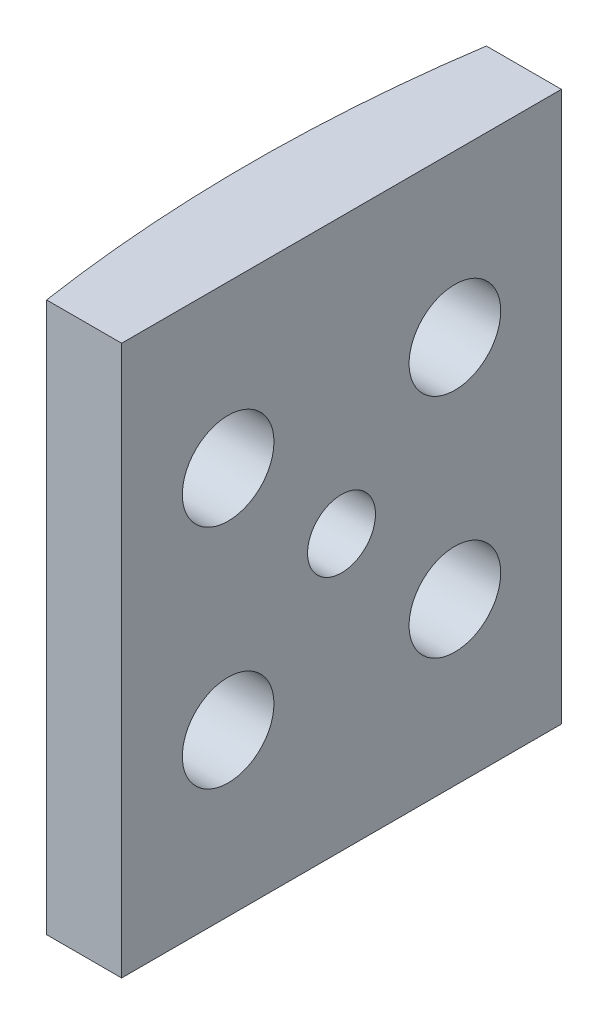
ISO-10303-21;
HEADER;
FILE_DESCRIPTION(('STEP AP214'),'2;1');
FILE_NAME('part.step','',(''),(''),'','','');
FILE_SCHEMA(('AUTOMOTIVE_DESIGN { 1 0 10303 214 1 1 1 1 }'));
ENDSEC;
DATA;
#1=APPLICATION_CONTEXT('core data for automotive mechanical design processes');
#2=APPLICATION_PROTOCOL_DEFINITION('international standard','automotive_design',2000,#1);
#3=PRODUCT_CONTEXT('',#1,'mechanical');
#4=PRODUCT('Part','Part','',(#3));
#5=PRODUCT_RELATED_PRODUCT_CATEGORY('part','',(#4));
#6=PRODUCT_DEFINITION_FORMATION('','',#4);
#7=PRODUCT_DEFINITION_CONTEXT('part definition',#1,'design');
#8=PRODUCT_DEFINITION('design','',#6,#7);
#9=PRODUCT_DEFINITION_SHAPE('','',#8);
#10=(LENGTH_UNIT() NAMED_UNIT(*) SI_UNIT(.MILLI.,.METRE.));
#11=(NAMED_UNIT(*) PLANE_ANGLE_UNIT() SI_UNIT($,.RADIAN.));
#12=(NAMED_UNIT(*) SI_UNIT($,.STERADIAN.) SOLID_ANGLE_UNIT());
#13=UNCERTAINTY_MEASURE_WITH_UNIT(LENGTH_MEASURE(1.E-05),#10,'distance_accuracy_value','');
#14=(GEOMETRIC_REPRESENTATION_CONTEXT(3) GLOBAL_UNCERTAINTY_ASSIGNED_CONTEXT((#13)) GLOBAL_UNIT_ASSIGNED_CONTEXT((#10,
#11,#12)) REPRESENTATION_CONTEXT('',''));
#15=CARTESIAN_POINT('',(0.,0.,0.));
#16=DIRECTION('',(0.,0.,1.));
#17=DIRECTION('',(1.,0.,0.));
#18=AXIS2_PLACEMENT_3D('',#15,#16,#17);
#19=CARTESIAN_POINT('',(0.,30.,0.));
#20=DIRECTION('',(0.,-1.,0.));
#21=DIRECTION('',(0.,0.,-1.));
#22=AXIS2_PLACEMENT_3D('',#19,#20,#21);
#23=CYLINDRICAL_SURFACE('',#22,80.);
#24=CARTESIAN_POINT('',(-79.9149840247554,21.1871843353823,3.68718433538232));
#25=CARTESIAN_POINT('',(-79.9149840705612,21.327478753355,3.68719054738318));
#26=CARTESIAN_POINT('',(-79.9144400425109,21.4678740099548,3.69903357550889));
#27=CARTESIAN_POINT('',(-79.9122467887078,21.744796035929,3.74611092882562));
#28=CARTESIAN_POINT('',(-79.9105962444419,21.8813179873865,3.78137315962007));
#29=CARTESIAN_POINT('',(-79.9061457113039,22.1464419220179,3.87427773772286));
#30=CARTESIAN_POINT('',(-79.9033462778901,22.2750476979545,3.9319092693181));
#31=CARTESIAN_POINT('',(-79.8965386035996,22.5207140595117,4.06789022045583));
#32=CARTESIAN_POINT('',(-79.8925306613278,22.6377774876091,4.14623452158376));
#33=CARTESIAN_POINT('',(-79.8832451140172,22.8571238328686,4.32143784877369));
#34=CARTESIAN_POINT('',(-79.8779670757142,22.9594016871702,4.41830319054468));
#35=CARTESIAN_POINT('',(-79.8661051861391,23.1462437135003,4.62776652054982));
#36=CARTESIAN_POINT('',(-79.859521281179,23.2308071569415,4.74036515557129));
#37=CARTESIAN_POINT('',(-79.8450486285362,23.3799118678161,4.97819183219913));
#38=CARTESIAN_POINT('',(-79.8371586541144,23.4444341459237,5.1034317036438));
#39=CARTESIAN_POINT('',(-79.8201501552768,23.5515500549235,5.36288301292818));
#40=CARTESIAN_POINT('',(-79.8110316216615,23.5941435215998,5.49709451794437));
#41=CARTESIAN_POINT('',(-79.7916971217471,23.656295464208,5.77095667515239));
#42=CARTESIAN_POINT('',(-79.7814789931121,23.6758076135009,5.9106176870186));
#43=CARTESIAN_POINT('',(-79.7601981478472,23.6911254662846,6.19116957974365));
#44=CARTESIAN_POINT('',(-79.7491354185713,23.6869308147515,6.33206047898925));
#45=CARTESIAN_POINT('',(-79.7264575936118,23.6549366112982,6.61147974691779));
#46=CARTESIAN_POINT('',(-79.7148410852146,23.6270732623434,6.75000069717082));
#47=CARTESIAN_POINT('',(-79.6914846132351,23.5484573743693,7.02037792225339));
#48=CARTESIAN_POINT('',(-79.6797446476664,23.497704466517,7.15223408965129));
#49=CARTESIAN_POINT('',(-79.6565792553965,23.3746277550698,7.40578381016997));
#50=CARTESIAN_POINT('',(-79.6451544185239,23.3022661514533,7.52745907239889));
#51=CARTESIAN_POINT('',(-79.6231334096055,23.1380331774133,7.75692813499166));
#52=CARTESIAN_POINT('',(-79.6125372357724,23.0461618490682,7.8647219652941));
#53=CARTESIAN_POINT('',(-79.5926787809198,22.8456133379769,8.06321553563528));
#54=CARTESIAN_POINT('',(-79.5834148545504,22.7369572349643,8.15393640460303));
#55=CARTESIAN_POINT('',(-79.5666620610593,22.5058193674423,8.31582430328858));
#56=CARTESIAN_POINT('',(-79.5591731504231,22.3833379419699,8.38699181236459));
#57=CARTESIAN_POINT('',(-79.5463860435208,22.1286091952973,8.50741653735249));
#58=CARTESIAN_POINT('',(-79.5410781554245,21.9964082254678,8.5567707608469));
#59=CARTESIAN_POINT('',(-79.532886278729,21.7255251979214,8.6325817351851));
#60=CARTESIAN_POINT('',(-79.5300022123177,21.5868433484111,8.65903922108405));
#61=CARTESIAN_POINT('',(-79.5268218497953,21.3076752243178,8.68820030683052));
#62=CARTESIAN_POINT('',(-79.5265127433752,21.1672013685883,8.69102149658153));
#63=CARTESIAN_POINT('',(-79.5284652945955,20.887779327858,8.67313587931655));
#64=CARTESIAN_POINT('',(-79.530726915335,20.7488311209864,8.65242941002279));
#65=CARTESIAN_POINT('',(-79.5376933818496,20.4766385666464,8.58815248850027));
#66=CARTESIAN_POINT('',(-79.5423941683076,20.343385139366,8.54462002256979));
#67=CARTESIAN_POINT('',(-79.5539891072692,20.0860879672421,8.43598151731332));
#68=CARTESIAN_POINT('',(-79.5608832887148,19.9620443439491,8.37087519331849));
#69=CARTESIAN_POINT('',(-79.5765365513388,19.7262762356674,8.22073734351685));
#70=CARTESIAN_POINT('',(-79.5853011377248,19.6145896279235,8.13564692205147));
#71=CARTESIAN_POINT('',(-79.6042520961256,19.4070649994753,7.94807594365137));
#72=CARTESIAN_POINT('',(-79.6144385098552,19.3112274439448,7.8455948764755));
#73=CARTESIAN_POINT('',(-79.635815740614,19.1375918211847,7.6255563815462));
#74=CARTESIAN_POINT('',(-79.6470115376266,19.0598908403134,7.50792282051117));
#75=CARTESIAN_POINT('',(-79.6698719590744,18.9253364922291,7.26132336552585));
#76=CARTESIAN_POINT('',(-79.681536593724,18.8684835794964,7.13235722460542));
#77=CARTESIAN_POINT('',(-79.7049111482667,18.7770444467885,6.86622400045525));
#78=CARTESIAN_POINT('',(-79.7166210763771,18.742541197651,6.72902840133906));
#79=CARTESIAN_POINT('',(-79.739621835849,18.697122530809,6.45075142678496));
#80=CARTESIAN_POINT('',(-79.7509126648291,18.6862072471224,6.30967002927404));
#81=CARTESIAN_POINT('',(-79.7727282098638,18.6882991254512,6.02759069112036));
#82=CARTESIAN_POINT('',(-79.783252748346,18.7013118140647,5.88659277728395));
#83=CARTESIAN_POINT('',(-79.8032674317407,18.7509345157692,5.60873570047085));
#84=CARTESIAN_POINT('',(-79.8127575860354,18.7875443148074,5.47187649996304));
#85=CARTESIAN_POINT('',(-79.8305067722288,18.8832430159716,5.2065196836551));
#86=CARTESIAN_POINT('',(-79.8387685136348,18.9422813924377,5.07800402845088));
#87=CARTESIAN_POINT('',(-79.8539930191797,19.0811883307517,4.83269292145727));
#88=CARTESIAN_POINT('',(-79.8609558517698,19.1610557943943,4.71589685220679));
#89=CARTESIAN_POINT('',(-79.8735426944666,19.3391178772601,4.49767868280057));
#90=CARTESIAN_POINT('',(-79.8791702854114,19.4372621890488,4.39621573429444));
#91=CARTESIAN_POINT('',(-79.8891396358739,19.6492707275327,4.21117323744156));
#92=CARTESIAN_POINT('',(-79.8934810898869,19.7631386797668,4.12759793937408));
#93=CARTESIAN_POINT('',(-79.9009274391805,20.0031733035219,3.98085461391951));
#94=CARTESIAN_POINT('',(-79.9040338208468,20.1293249627105,3.91766207367641));
#95=CARTESIAN_POINT('',(-79.9090772665462,20.3903668152794,3.81341318582625));
#96=CARTESIAN_POINT('',(-79.9110157274555,20.5252463550137,3.77233040044446));
#97=CARTESIAN_POINT('',(-79.9132620544998,20.7486793744813,3.72436103797756));
#98=CARTESIAN_POINT('',(-79.9139083167273,20.8357817304316,3.71043738441047));
#99=CARTESIAN_POINT('',(-79.9147692874051,21.0109709066596,3.69184708342571));
#100=CARTESIAN_POINT('',(-79.9149839959823,21.0990577266477,3.68718043328431));
#101=CARTESIAN_POINT('',(-79.9149840247554,21.1871843353823,3.68718433538232));
#102=B_SPLINE_CURVE_WITH_KNOTS('',3,(#24,#25,#26,#27,#28,#29,#30,#31,#32,#33,#34,#35,#36,#37,
#38,#39,#40,#41,#42,#43,#44,#45,#46,#47,#48,#49,#50,#51,#52,#53,#54,#55,#56,#57,#58,#59,#60,#61,
#62,#63,#64,#65,#66,#67,#68,#69,#70,#71,#72,#73,#74,#75,#76,#77,#78,#79,#80,#81,#82,#83,#84,#85,
#86,#87,#88,#89,#90,#91,#92,#93,#94,#95,#96,#97,#98,#99,#100,#101),.UNSPECIFIED.,.T.,.F.,(4,2,2,
2,2,2,2,2,2,2,2,2,2,2,2,2,2,2,2,2,2,2,2,2,2,2,2,2,2,2,2,2,2,2,2,2,2,2,4),(0.,0.420561611727577,
0.841625253026377,1.26248556021401,1.68324196399404,2.10414210319849,2.52505955047722,
2.94637461566971,3.36769283587658,3.78985525908463,4.21202400444997,4.63533429506359,
5.05865140696861,5.48271340773121,5.90677449388889,6.33030727443012,6.75382967097413,
7.17544915555916,7.59705510436972,8.01656232231404,8.43606351861693,8.85486879974165,
9.27367960725659,9.69374054452014,10.1138138084936,10.5360866674945,10.9583687313422,
11.3822096233145,11.8060529233841,12.2299941300291,12.6539314910931,13.0769194426141,
13.4998850967698,13.9217032900297,14.3436216003866,14.7650305919284,15.1859345570397,
15.4501124198951,15.7142902050203),.UNSPECIFIED.);
#103=CARTESIAN_POINT('',(-79.9149840247554,21.1871843353823,3.68718433538232));
#104=VERTEX_POINT('',#103);
#105=EDGE_CURVE('E100',#104,#104,#102,.T.);
#106=ORIENTED_EDGE('',*,*,#105,.T.);
#107=EDGE_LOOP('',(#106));
#108=FACE_BOUND('',#107,.T.);
#109=CARTESIAN_POINT('',(-79.9149840247554,8.81281566461768,3.68718433538226));
#110=CARTESIAN_POINT('',(-79.9149840705612,8.95311008259044,3.68719054738312));
#111=CARTESIAN_POINT('',(-79.914440042511,9.09350533919024,3.69903357550883));
#112=CARTESIAN_POINT('',(-79.9122467887078,9.37042736516441,3.74611092882556));
#113=CARTESIAN_POINT('',(-79.9105962444419,9.5069493166219,3.78137315962001));
#114=CARTESIAN_POINT('',(-79.9061457113039,9.77207325125331,3.8742777377228));
#115=CARTESIAN_POINT('',(-79.9033462778901,9.90067902718989,3.93190926931804));
#116=CARTESIAN_POINT('',(-79.8965386035996,10.1463453887471,4.06789022045576));
#117=CARTESIAN_POINT('',(-79.8925306613278,10.2634088168445,4.1462345215837));
#118=CARTESIAN_POINT('',(-79.8832451140172,10.482755162104,4.32143784877363));
#119=CARTESIAN_POINT('',(-79.8779670757142,10.5850330164056,4.41830319054461));
#120=CARTESIAN_POINT('',(-79.8661051861391,10.7718750427357,4.62776652054975));
#121=CARTESIAN_POINT('',(-79.859521281179,10.8564384861769,4.74036515557123));
#122=CARTESIAN_POINT('',(-79.8450486285362,11.0055431970516,4.97819183219907));
#123=CARTESIAN_POINT('',(-79.8371586541144,11.0700654751591,5.10343170364373));
#124=CARTESIAN_POINT('',(-79.8201501552768,11.177181384159,5.36288301292811));
#125=CARTESIAN_POINT('',(-79.8110316216615,11.2197748508352,5.49709451794431));
#126=CARTESIAN_POINT('',(-79.7916971217471,11.2819267934434,5.77095667515232));
#127=CARTESIAN_POINT('',(-79.7814789931121,11.3014389427363,5.91061768701854));
#128=CARTESIAN_POINT('',(-79.7601981478472,11.31675679552,6.19116957974359));
#129=CARTESIAN_POINT('',(-79.7491354185713,11.3125621439869,6.33206047898919));
#130=CARTESIAN_POINT('',(-79.7264575936118,11.2805679405336,6.61147974691773));
#131=CARTESIAN_POINT('',(-79.7148410852147,11.2527045915788,6.75000069717076));
#132=CARTESIAN_POINT('',(-79.6914846132351,11.1740887036047,7.02037792225332));
#133=CARTESIAN_POINT('',(-79.6797446476664,11.1233357957524,7.15223408965122));
#134=CARTESIAN_POINT('',(-79.6565792553965,11.0002590843052,7.40578381016991));
#135=CARTESIAN_POINT('',(-79.645154418524,10.9278974806887,7.52745907239883));
#136=CARTESIAN_POINT('',(-79.6231334096055,10.7636645066488,7.7569281349916));
#137=CARTESIAN_POINT('',(-79.6125372357724,10.6717931783037,7.86472196529403));
#138=CARTESIAN_POINT('',(-79.5926787809198,10.4712446672123,8.06321553563521));
#139=CARTESIAN_POINT('',(-79.5834148545504,10.3625885641997,8.15393640460296));
#140=CARTESIAN_POINT('',(-79.5666620610593,10.1314506966777,8.31582430328852));
#141=CARTESIAN_POINT('',(-79.5591731504231,10.0089692712053,8.38699181236453));
#142=CARTESIAN_POINT('',(-79.5463860435208,9.75424052453269,8.50741653735242));
#143=CARTESIAN_POINT('',(-79.5410781554245,9.62203955470327,8.55677076084684));
#144=CARTESIAN_POINT('',(-79.532886278729,9.35115652715682,8.63258173518504));
#145=CARTESIAN_POINT('',(-79.5300022123177,9.21247467764648,8.65903922108399));
#146=CARTESIAN_POINT('',(-79.5268218497953,8.93330655355321,8.68820030683045));
#147=CARTESIAN_POINT('',(-79.5265127433752,8.79283269782376,8.69102149658147));
#148=CARTESIAN_POINT('',(-79.5284652945955,8.51341065709339,8.67313587931649));
#149=CARTESIAN_POINT('',(-79.530726915335,8.37446245022182,8.65242941002273));
#150=CARTESIAN_POINT('',(-79.5376933818496,8.10226989588182,8.5881524885002));
#151=CARTESIAN_POINT('',(-79.5423941683076,7.9690164686014,8.54462002256973));
#152=CARTESIAN_POINT('',(-79.5539891072693,7.7117192964775,8.43598151731326));
#153=CARTESIAN_POINT('',(-79.5608832887148,7.58767567318457,8.37087519331842));
#154=CARTESIAN_POINT('',(-79.5765365513388,7.35190756490286,8.22073734351679));
#155=CARTESIAN_POINT('',(-79.5853011377248,7.2402209571589,8.13564692205141));
#156=CARTESIAN_POINT('',(-79.6042520961256,7.03269632871068,7.94807594365131));
#157=CARTESIAN_POINT('',(-79.6144385098552,6.93685877318021,7.84559487647544));
#158=CARTESIAN_POINT('',(-79.635815740614,6.76322315042014,7.62555638154614));
#159=CARTESIAN_POINT('',(-79.6470115376266,6.6855221695488,7.50792282051111));
#160=CARTESIAN_POINT('',(-79.6698719590744,6.55096782146452,7.26132336552579));
#161=CARTESIAN_POINT('',(-79.681536593724,6.49411490873186,7.13235722460536));
#162=CARTESIAN_POINT('',(-79.7049111482668,6.4026757760239,6.86622400045519));
#163=CARTESIAN_POINT('',(-79.7166210763771,6.3681725268864,6.729028401339));
#164=CARTESIAN_POINT('',(-79.739621835849,6.32275386004441,6.4507514267849));
#165=CARTESIAN_POINT('',(-79.7509126648291,6.31183857635783,6.30967002927397));
#166=CARTESIAN_POINT('',(-79.7727282098638,6.31393045468661,6.0275906911203));
#167=CARTESIAN_POINT('',(-79.783252748346,6.3269431433001,5.88659277728389));
#168=CARTESIAN_POINT('',(-79.8032674317407,6.37656584500467,5.60873570047079));
#169=CARTESIAN_POINT('',(-79.8127575860354,6.41317564404279,5.47187649996298));
#170=CARTESIAN_POINT('',(-79.8305067722288,6.50887434520706,5.20651968365504));
#171=CARTESIAN_POINT('',(-79.8387685136348,6.56791272167316,5.07800402845082));
#172=CARTESIAN_POINT('',(-79.8539930191797,6.70681965998716,4.83269292145721));
#173=CARTESIAN_POINT('',(-79.8609558517698,6.7866871236297,4.71589685220673));
#174=CARTESIAN_POINT('',(-79.8735426944666,6.96474920649549,4.49767868280051));
#175=CARTESIAN_POINT('',(-79.8791702854114,7.06289351828425,4.39621573429438));
#176=CARTESIAN_POINT('',(-79.8891396358739,7.27490205676815,4.2111732374415));
#177=CARTESIAN_POINT('',(-79.8934810898869,7.38877000900222,4.12759793937401));
#178=CARTESIAN_POINT('',(-79.9009274391805,7.62880463275732,3.98085461391944));
#179=CARTESIAN_POINT('',(-79.9040338208468,7.75495629194595,3.91766207367635));
#180=CARTESIAN_POINT('',(-79.9090772665462,8.01599814451482,3.81341318582619));
#181=CARTESIAN_POINT('',(-79.9110157274555,8.15087768424912,3.7723304004444));
#182=CARTESIAN_POINT('',(-79.9132620544998,8.37431070371673,3.7243610379775));
#183=CARTESIAN_POINT('',(-79.9139083167273,8.46141305966701,3.7104373844104));
#184=CARTESIAN_POINT('',(-79.9147692874051,8.63660223589506,3.69184708342564));
#185=CARTESIAN_POINT('',(-79.9149839959823,8.72468905588316,3.68718043328425));
#186=CARTESIAN_POINT('',(-79.9149840247554,8.81281566461768,3.68718433538226));
#187=B_SPLINE_CURVE_WITH_KNOTS('',3,(#109,#110,#111,#112,#113,#114,#115,#116,#117,#118,#119,
#120,#121,#122,#123,#124,#125,#126,#127,#128,#129,#130,#131,#132,#133,#134,#135,#136,#137,#138,
#139,#140,#141,#142,#143,#144,#145,#146,#147,#148,#149,#150,#151,#152,#153,#154,#155,#156,#157,
#158,#159,#160,#161,#162,#163,#164,#165,#166,#167,#168,#169,#170,#171,#172,#173,#174,#175,#176,
#177,#178,#179,#180,#181,#182,#183,#184,#185,#186),.UNSPECIFIED.,.T.,.F.,(4,2,2,2,2,2,2,2,2,2,2,
2,2,2,2,2,2,2,2,2,2,2,2,2,2,2,2,2,2,2,2,2,2,2,2,2,2,2,4),(0.,0.420561611727575,
0.841625253026375,1.262485560214,1.68324196399403,2.10414210319848,2.52505955047722,
2.94637461566971,3.36769283587657,3.78985525908462,4.21202400444997,4.63533429506359,
5.0586514069686,5.48271340773121,5.90677449388888,6.33030727443012,6.75382967097413,
7.17544915555915,7.59705510436971,8.01656232231403,8.43606351861693,8.85486879974166,
9.27367960725659,9.69374054452013,10.1138138084936,10.5360866674945,10.9583687313422,
11.3822096233145,11.8060529233841,12.229994130029,12.6539314910931,13.0769194426141,
13.4998850967698,13.9217032900297,14.3436216003866,14.7650305919284,15.1859345570397,
15.4501124198951,15.7142902050203),.UNSPECIFIED.);
#188=CARTESIAN_POINT('',(-79.9149840247554,8.81281566461768,3.68718433538226));
#189=VERTEX_POINT('',#188);
#190=EDGE_CURVE('E117',#189,#189,#187,.T.);
#191=ORIENTED_EDGE('',*,*,#190,.T.);
#192=EDGE_LOOP('',(#191));
#193=FACE_BOUND('',#192,.T.);
#194=CARTESIAN_POINT('',(-79.5269314655299,8.81281566461774,-8.68718433538232));
#195=CARTESIAN_POINT('',(-79.5269324858222,8.95267469328703,-8.68717804446854));
#196=CARTESIAN_POINT('',(-79.5282206517571,9.09263461440218,-8.67540749585827));
#197=CARTESIAN_POINT('',(-79.5333093377235,9.36868543686049,-8.6286289567505));
#198=CARTESIAN_POINT('',(-79.5371128615772,9.50477150916491,-8.59359318288199));
#199=CARTESIAN_POINT('',(-79.5470280320749,9.76902338018718,-8.50132173776275));
#200=CARTESIAN_POINT('',(-79.5531382379501,9.89719406488038,-8.44409992345734));
#201=CARTESIAN_POINT('',(-79.567348494481,10.1420604655234,-8.30912967703781));
#202=CARTESIAN_POINT('',(-79.575448089113,10.2587588026856,-8.23138594881877));
#203=CARTESIAN_POINT('',(-79.5932616900974,10.4778195422029,-8.0573164904031));
#204=CARTESIAN_POINT('',(-79.6029806820081,10.5801358160903,-7.96093322363112));
#205=CARTESIAN_POINT('',(-79.6235521665151,10.7671626888264,-7.75247624259055));
#206=CARTESIAN_POINT('',(-79.6344047329769,10.8518721393084,-7.64040150567735));
#207=CARTESIAN_POINT('',(-79.6568153962913,11.0017239064634,-7.40310838637308));
#208=CARTESIAN_POINT('',(-79.6683768170474,11.0667639534977,-7.27782572556751));
#209=CARTESIAN_POINT('',(-79.691673633135,11.1748729182015,-7.01812896512196));
#210=CARTESIAN_POINT('',(-79.7034090312871,11.2179414792528,-6.88371471730774));
#211=CARTESIAN_POINT('',(-79.7266447255344,11.2809762396418,-6.60917078469951));
#212=CARTESIAN_POINT('',(-79.7381443084905,11.3008803110779,-6.46902676845396));
#213=CARTESIAN_POINT('',(-79.7604966234599,11.316792567589,-6.18733688232943));
#214=CARTESIAN_POINT('',(-79.7713493579375,11.3128008437013,-6.04579101779322));
#215=CARTESIAN_POINT('',(-79.7921019470659,11.2810160562886,-5.76543278158703));
#216=CARTESIAN_POINT('',(-79.8020025104735,11.2532408511359,-5.62661843887452));
#217=CARTESIAN_POINT('',(-79.8206501297098,11.1746683110479,-5.35558371340433));
#218=CARTESIAN_POINT('',(-79.8293971994424,11.1238712536456,-5.22336325117747));
#219=CARTESIAN_POINT('',(-79.8455932792629,11.0008340374366,-4.96964492262686));
#220=CARTESIAN_POINT('',(-79.853045586794,10.9286496555694,-4.84812021864277));
#221=CARTESIAN_POINT('',(-79.8666323707913,10.7648220567043,-4.61890006946411));
#222=CARTESIAN_POINT('',(-79.8727668647234,10.6731790976346,-4.51120444099209));
#223=CARTESIAN_POINT('',(-79.8837158662476,10.4732745446772,-4.31297967808633));
#224=CARTESIAN_POINT('',(-79.8885334928779,10.3650531837054,-4.22241013977927));
#225=CARTESIAN_POINT('',(-79.8969157966667,10.1349029022012,-4.06071700875837));
#226=CARTESIAN_POINT('',(-79.9004804831454,10.0129740836449,-3.98959327139181));
#227=CARTESIAN_POINT('',(-79.9064150653196,9.7590484128207,-3.86891390989494));
#228=CARTESIAN_POINT('',(-79.9087865616163,9.62706532312216,-3.81932940430573));
#229=CARTESIAN_POINT('',(-79.912398062874,9.35663594841803,-3.74300788337237));
#230=CARTESIAN_POINT('',(-79.9136380715325,9.21818968453379,-3.71627079336946));
#231=CARTESIAN_POINT('',(-79.915020874203,8.93884034789247,-3.68641652967099));
#232=CARTESIAN_POINT('',(-79.9151642315284,8.79793857373597,-3.68328722944754));
#233=CARTESIAN_POINT('',(-79.914359467841,8.51760948130522,-3.70070586796942));
#234=CARTESIAN_POINT('',(-79.913411348209,8.37818216116595,-3.72125377676183));
#235=CARTESIAN_POINT('',(-79.9103966437166,8.10477376105674,-3.78543650339474));
#236=CARTESIAN_POINT('',(-79.9083301678359,7.97079215178964,-3.8290690717103));
#237=CARTESIAN_POINT('',(-79.9030272365357,7.71206238849974,-3.93817269084654));
#238=CARTESIAN_POINT('',(-79.8997907820948,7.58731422675415,-4.00364372340143));
#239=CARTESIAN_POINT('',(-79.89208509805,7.350564804323,-4.15456702996704));
#240=CARTESIAN_POINT('',(-79.8876156371107,7.23856594122495,-4.24002305308471));
#241=CARTESIAN_POINT('',(-79.8773908375076,7.03051092710659,-4.42846621449014));
#242=CARTESIAN_POINT('',(-79.8716354968755,6.93445480049332,-4.53145337961617));
#243=CARTESIAN_POINT('',(-79.8588115682756,6.76093058120952,-4.75209552906724));
#244=CARTESIAN_POINT('',(-79.8517420550762,6.6834756731658,-4.86976082808612));
#245=CARTESIAN_POINT('',(-79.8363217215909,6.54941217954532,-5.11634388124974));
#246=CARTESIAN_POINT('',(-79.8279708939011,6.49280371443268,-5.24526170041342));
#247=CARTESIAN_POINT('',(-79.8100724367637,6.4019268171764,-5.51090497529738));
#248=CARTESIAN_POINT('',(-79.8005228479984,6.36769554143346,-5.64764300891541));
#249=CARTESIAN_POINT('',(-79.7804201469965,6.32265483502093,-5.92485165856107));
#250=CARTESIAN_POINT('',(-79.769867017885,6.31184579827862,-6.06532233732602));
#251=CARTESIAN_POINT('',(-79.7479979959328,6.31392501630869,-6.34639557617929));
#252=CARTESIAN_POINT('',(-79.7366801942679,6.32687485569874,-6.48699753213014));
#253=CARTESIAN_POINT('',(-79.7136603923105,6.37620377539842,-6.76399815971304));
#254=CARTESIAN_POINT('',(-79.701958384767,6.4125832981337,-6.90039675192148));
#255=CARTESIAN_POINT('',(-79.6785667652818,6.50785058773164,-7.1654556237899));
#256=CARTESIAN_POINT('',(-79.6668772449607,6.56679033694484,-7.29409723176382));
#257=CARTESIAN_POINT('',(-79.6440136924048,6.70551332640119,-7.5396490499922));
#258=CARTESIAN_POINT('',(-79.6328396429137,6.78529586829614,-7.65655965311823));
#259=CARTESIAN_POINT('',(-79.611505175978,6.9634481805161,-7.87529932098487));
#260=CARTESIAN_POINT('',(-79.6013445141208,7.06181345234831,-7.97713202515131));
#261=CARTESIAN_POINT('',(-79.5825150322088,7.27441164584624,-8.16284504881971));
#262=CARTESIAN_POINT('',(-79.5738465554439,7.38864820794498,-8.24672123834887));
#263=CARTESIAN_POINT('',(-79.558465083895,7.62933508514578,-8.39381337617969));
#264=CARTESIAN_POINT('',(-79.5517460097076,7.75574575498232,-8.45709363179843));
#265=CARTESIAN_POINT('',(-79.5405839381168,8.01739692641714,-8.56144190687245));
#266=CARTESIAN_POINT('',(-79.536138131119,8.15262629440606,-8.6025373486792));
#267=CARTESIAN_POINT('',(-79.530952864063,8.37608298400792,-8.65030931047309));
#268=CARTESIAN_POINT('',(-79.5294481343782,8.46283243461639,-8.66411950429378));
#269=CARTESIAN_POINT('',(-79.52743711678,8.63731323551945,-8.68255897400317));
#270=CARTESIAN_POINT('',(-79.5269308252269,8.72504458223347,-8.68718828335991));
#271=CARTESIAN_POINT('',(-79.5269314655299,8.81281566461774,-8.68718433538232));
#272=B_SPLINE_CURVE_WITH_KNOTS('',3,(#194,#195,#196,#197,#198,#199,#200,#201,#202,#203,#204,
#205,#206,#207,#208,#209,#210,#211,#212,#213,#214,#215,#216,#217,#218,#219,#220,#221,#222,#223,
#224,#225,#226,#227,#228,#229,#230,#231,#232,#233,#234,#235,#236,#237,#238,#239,#240,#241,#242,
#243,#244,#245,#246,#247,#248,#249,#250,#251,#252,#253,#254,#255,#256,#257,#258,#259,#260,#261,
#262,#263,#264,#265,#266,#267,#268,#269,#270,#271),.UNSPECIFIED.,.T.,.F.,(4,2,2,2,2,2,2,2,2,2,2,
2,2,2,2,2,2,2,2,2,2,2,2,2,2,2,2,2,2,2,2,2,2,2,2,2,2,2,4),(0.,0.419255670030955,
0.839012918462378,1.25850841637526,1.67790784371968,2.09862315637939,2.51936590067511,
2.94226007443141,3.36516111194542,3.78919378856759,4.21322484972422,4.63693779635172,
5.0606456351737,5.48325805093044,5.90586486520508,6.32746187454077,6.7490557476306,
7.17008255701787,7.59110799060604,8.0119171428498,8.43272576274855,8.8534933837676,
9.27426065285586,9.69510691966499,10.1159538307497,10.5370981653689,10.958244933592,
11.3800892342782,11.8019406297041,12.2248870377705,12.6478414326209,13.0717763060439,
13.4956969771382,13.9195151570438,14.3434307100516,14.7660096694499,15.1880650816117,
15.4511775774633,15.714289114162),.UNSPECIFIED.);
#273=CARTESIAN_POINT('',(-79.5269314655299,8.81281566461774,-8.68718433538232));
#274=VERTEX_POINT('',#273);
#275=EDGE_CURVE('E154',#274,#274,#272,.T.);
#276=ORIENTED_EDGE('',*,*,#275,.T.);
#277=EDGE_LOOP('',(#276));
#278=FACE_BOUND('',#277,.T.);
#279=CARTESIAN_POINT('',(-79.5269314655299,21.1871843353823,-8.68718433538225));
#280=CARTESIAN_POINT('',(-79.5269324858222,21.3270433640516,-8.68717804446847));
#281=CARTESIAN_POINT('',(-79.5282206517571,21.4670032851668,-8.6754074958582));
#282=CARTESIAN_POINT('',(-79.5333093377235,21.7430541076251,-8.62862895675043));
#283=CARTESIAN_POINT('',(-79.5371128615772,21.8791401799295,-8.59359318288192));
#284=CARTESIAN_POINT('',(-79.5470280320749,22.1433920509518,-8.50132173776268));
#285=CARTESIAN_POINT('',(-79.5531382379501,22.271562735645,-8.44409992345727));
#286=CARTESIAN_POINT('',(-79.5673484944811,22.516429136288,-8.30912967703774));
#287=CARTESIAN_POINT('',(-79.575448089113,22.6331274734502,-8.2313859488187));
#288=CARTESIAN_POINT('',(-79.5932616900974,22.8521882129675,-8.05731649040303));
#289=CARTESIAN_POINT('',(-79.6029806820081,22.9545044868549,-7.96093322363104));
#290=CARTESIAN_POINT('',(-79.6235521665151,23.141531359591,-7.75247624259048));
#291=CARTESIAN_POINT('',(-79.6344047329769,23.226240810073,-7.64040150567727));
#292=CARTESIAN_POINT('',(-79.6568153962913,23.376092577228,-7.40310838637301));
#293=CARTESIAN_POINT('',(-79.6683768170474,23.4411326242623,-7.27782572556743));
#294=CARTESIAN_POINT('',(-79.691673633135,23.5492415889661,-7.01812896512189));
#295=CARTESIAN_POINT('',(-79.7034090312871,23.5923101500174,-6.88371471730767));
#296=CARTESIAN_POINT('',(-79.7266447255344,23.6553449104063,-6.60917078469944));
#297=CARTESIAN_POINT('',(-79.7381443084905,23.6752489818425,-6.46902676845389));
#298=CARTESIAN_POINT('',(-79.76049662346,23.6911612383535,-6.18733688232936));
#299=CARTESIAN_POINT('',(-79.7713493579375,23.6871695144659,-6.04579101779315));
#300=CARTESIAN_POINT('',(-79.7921019470659,23.6553847270532,-5.76543278158696));
#301=CARTESIAN_POINT('',(-79.8020025104735,23.6276095219005,-5.62661843887445));
#302=CARTESIAN_POINT('',(-79.8206501297098,23.5490369818125,-5.35558371340426));
#303=CARTESIAN_POINT('',(-79.8293971994425,23.4982399244101,-5.2233632511774));
#304=CARTESIAN_POINT('',(-79.8455932792629,23.3752027082012,-4.96964492262679));
#305=CARTESIAN_POINT('',(-79.853045586794,23.303018326334,-4.8481202186427));
#306=CARTESIAN_POINT('',(-79.8666323707913,23.1391907274689,-4.61890006946404));
#307=CARTESIAN_POINT('',(-79.8727668647234,23.0475477683992,-4.51120444099202));
#308=CARTESIAN_POINT('',(-79.8837158662476,22.8476432154418,-4.31297967808626));
#309=CARTESIAN_POINT('',(-79.8885334928779,22.7394218544699,-4.2224101397792));
#310=CARTESIAN_POINT('',(-79.8969157966666,22.5092715729658,-4.0607170087583));
#311=CARTESIAN_POINT('',(-79.9004804831454,22.3873427544095,-3.98959327139174));
#312=CARTESIAN_POINT('',(-79.9064150653196,22.1334170835853,-3.86891390989487));
#313=CARTESIAN_POINT('',(-79.9087865616163,22.0014339938867,-3.81932940430566));
#314=CARTESIAN_POINT('',(-79.912398062874,21.7310046191826,-3.7430078833723));
#315=CARTESIAN_POINT('',(-79.9136380715325,21.5925583552984,-3.71627079336939));
#316=CARTESIAN_POINT('',(-79.915020874203,21.3132090186571,-3.68641652967092));
#317=CARTESIAN_POINT('',(-79.9151642315284,21.1723072445006,-3.68328722944748));
#318=CARTESIAN_POINT('',(-79.914359467841,20.8919781520698,-3.70070586796935));
#319=CARTESIAN_POINT('',(-79.913411348209,20.7525508319305,-3.72125377676176));
#320=CARTESIAN_POINT('',(-79.9103966437166,20.4791424318213,-3.78543650339467));
#321=CARTESIAN_POINT('',(-79.9083301678359,20.3451608225542,-3.82906907171024));
#322=CARTESIAN_POINT('',(-79.9030272365357,20.0864310592643,-3.93817269084647));
#323=CARTESIAN_POINT('',(-79.8997907820948,19.9616828975187,-4.00364372340136));
#324=CARTESIAN_POINT('',(-79.89208509805,19.7249334750876,-4.15456702996697));
#325=CARTESIAN_POINT('',(-79.8876156371107,19.6129346119895,-4.24002305308464));
#326=CARTESIAN_POINT('',(-79.8773908375076,19.4048795978712,-4.42846621449007));
#327=CARTESIAN_POINT('',(-79.8716354968755,19.3088234712579,-4.5314533796161));
#328=CARTESIAN_POINT('',(-79.8588115682756,19.1352992519741,-4.75209552906718));
#329=CARTESIAN_POINT('',(-79.8517420550762,19.0578443439304,-4.86976082808605));
#330=CARTESIAN_POINT('',(-79.8363217215909,18.9237808503099,-5.11634388124967));
#331=CARTESIAN_POINT('',(-79.8279708939011,18.8671723851973,-5.24526170041336));
#332=CARTESIAN_POINT('',(-79.8100724367638,18.776295487941,-5.51090497529731));
#333=CARTESIAN_POINT('',(-79.8005228479984,18.742064212198,-5.64764300891534));
#334=CARTESIAN_POINT('',(-79.7804201469965,18.6970235057855,-5.924851658561));
#335=CARTESIAN_POINT('',(-79.769867017885,18.6862144690432,-6.06532233732595));
#336=CARTESIAN_POINT('',(-79.7479979959328,18.6882936870733,-6.34639557617922));
#337=CARTESIAN_POINT('',(-79.7366801942679,18.7012435264633,-6.48699753213007));
#338=CARTESIAN_POINT('',(-79.7136603923105,18.750572446163,-6.76399815971297));
#339=CARTESIAN_POINT('',(-79.701958384767,18.7869519688983,-6.90039675192141));
#340=CARTESIAN_POINT('',(-79.6785667652818,18.8822192584962,-7.16545562378983));
#341=CARTESIAN_POINT('',(-79.6668772449607,18.9411590077094,-7.29409723176376));
#342=CARTESIAN_POINT('',(-79.6440136924048,19.0798819971658,-7.53964904999213));
#343=CARTESIAN_POINT('',(-79.6328396429137,19.1596645390607,-7.65655965311816));
#344=CARTESIAN_POINT('',(-79.611505175978,19.3378168512807,-7.8752993209848));
#345=CARTESIAN_POINT('',(-79.6013445141209,19.4361821231129,-7.97713202515124));
#346=CARTESIAN_POINT('',(-79.5825150322088,19.6487803166108,-8.16284504881964));
#347=CARTESIAN_POINT('',(-79.5738465554439,19.7630168787096,-8.2467212383488));
#348=CARTESIAN_POINT('',(-79.558465083895,20.0037037559104,-8.39381337617962));
#349=CARTESIAN_POINT('',(-79.5517460097076,20.1301144257469,-8.45709363179836));
#350=CARTESIAN_POINT('',(-79.5405839381168,20.3917655971817,-8.56144190687238));
#351=CARTESIAN_POINT('',(-79.536138131119,20.5269949651706,-8.60253734867913));
#352=CARTESIAN_POINT('',(-79.530952864063,20.7504516547725,-8.65030931047302));
#353=CARTESIAN_POINT('',(-79.5294481343782,20.837201105381,-8.6641195042937));
#354=CARTESIAN_POINT('',(-79.52743711678,21.011681906284,-8.6825589740031));
#355=CARTESIAN_POINT('',(-79.5269308252269,21.099413252998,-8.68718828335984));
#356=CARTESIAN_POINT('',(-79.5269314655299,21.1871843353823,-8.68718433538225));
#357=B_SPLINE_CURVE_WITH_KNOTS('',3,(#279,#280,#281,#282,#283,#284,#285,#286,#287,#288,#289,
#290,#291,#292,#293,#294,#295,#296,#297,#298,#299,#300,#301,#302,#303,#304,#305,#306,#307,#308,
#309,#310,#311,#312,#313,#314,#315,#316,#317,#318,#319,#320,#321,#322,#323,#324,#325,#326,#327,
#328,#329,#330,#331,#332,#333,#334,#335,#336,#337,#338,#339,#340,#341,#342,#343,#344,#345,#346,
#347,#348,#349,#350,#351,#352,#353,#354,#355,#356),.UNSPECIFIED.,.T.,.F.,(4,2,2,2,2,2,2,2,2,2,2,
2,2,2,2,2,2,2,2,2,2,2,2,2,2,2,2,2,2,2,2,2,2,2,2,2,2,2,4),(0.,0.419255670030957,0.83901291846238,
1.25850841637526,1.67790784371968,2.0986231563794,2.51936590067511,2.94226007443141,
3.36516111194542,3.78919378856759,4.21322484972422,4.63693779635172,5.0606456351737,
5.48325805093044,5.90586486520508,6.32746187454077,6.7490557476306,7.17008255701786,
7.59110799060604,8.01191714284979,8.43272576274854,8.8534933837676,9.27426065285585,
9.69510691966499,10.1159538307497,10.5370981653689,10.958244933592,11.3800892342782,
11.8019406297041,12.2248870377705,12.6478414326209,13.0717763060439,13.4956969771382,
13.9195151570438,14.3434307100516,14.7660096694499,15.1880650816117,15.4511775774633,
15.714289114162),.UNSPECIFIED.);
#358=CARTESIAN_POINT('',(-79.5269314655299,21.1871843353823,-8.68718433538225));
#359=VERTEX_POINT('',#358);
#360=EDGE_CURVE('E146',#359,#359,#357,.T.);
#361=ORIENTED_EDGE('',*,*,#360,.T.);
#362=EDGE_LOOP('',(#361));
#363=FACE_BOUND('',#362,.T.);
#364=CARTESIAN_POINT('',(-79.9785234971153,15.,-1.85358550419841));
#365=CARTESIAN_POINT('',(-79.9785237871745,15.1041017176364,-1.8535808923142));
#366=CARTESIAN_POINT('',(-79.9787289315886,15.2082785631907,-1.84478617553594));
#367=CARTESIAN_POINT('',(-79.9795275536064,15.4137621411529,-1.80982492432169));
#368=CARTESIAN_POINT('',(-79.9801214964981,15.515065282759,-1.78363757499102));
#369=CARTESIAN_POINT('',(-79.9816303971291,15.7117948416386,-1.71463787556248));
#370=CARTESIAN_POINT('',(-79.9825451993025,15.8072240805111,-1.6718335809668));
#371=CARTESIAN_POINT('',(-79.9845925391103,15.9895154938468,-1.57082640540291));
#372=CARTESIAN_POINT('',(-79.9857250231749,16.0763797681385,-1.51262731164862));
#373=CARTESIAN_POINT('',(-79.9880805626702,16.2391310848619,-1.38245928042676));
#374=CARTESIAN_POINT('',(-79.9893036426833,16.3150151312783,-1.31048659715487));
#375=CARTESIAN_POINT('',(-79.9917022991501,16.4536269612943,-1.154820249622));
#376=CARTESIAN_POINT('',(-79.9928778737213,16.5163542239113,-1.07112612143374));
#377=CARTESIAN_POINT('',(-79.9950490659448,16.6268739478393,-0.894384892499268));
#378=CARTESIAN_POINT('',(-79.996044666705,16.674665007557,-0.801336915082564));
#379=CARTESIAN_POINT('',(-79.9977435235242,16.7539464232206,-0.608535611864275));
#380=CARTESIAN_POINT('',(-79.9984467805194,16.7854368313649,-0.508782307535838));
#381=CARTESIAN_POINT('',(-79.9994815593685,16.8312176917218,-0.305420951170992));
#382=CARTESIAN_POINT('',(-79.9998131481441,16.8455112403901,-0.201813596557092));
#383=CARTESIAN_POINT('',(-80.0000674341969,16.8565021643416,0.00633051113753879));
#384=CARTESIAN_POINT('',(-79.9999901327446,16.8531995942955,0.110867261329656));
#385=CARTESIAN_POINT('',(-79.9994354108872,16.8290946876532,0.317881741018899));
#386=CARTESIAN_POINT('',(-79.9989580671977,16.8082957063175,0.420359861438732));
#387=CARTESIAN_POINT('',(-79.9976571544688,16.7497935666168,0.620369503635736));
#388=CARTESIAN_POINT('',(-79.9968335848276,16.7120903788702,0.717901016814769));
#389=CARTESIAN_POINT('',(-79.9949329209039,16.6208462403922,0.905259596797814));
#390=CARTESIAN_POINT('',(-79.9938558019919,16.5673037509119,0.995085913966974));
#391=CARTESIAN_POINT('',(-79.9915694478108,16.4459020568815,1.16447599655517));
#392=CARTESIAN_POINT('',(-79.9903602123831,16.3780428351492,1.24403974965751));
#393=CARTESIAN_POINT('',(-79.9879455885245,16.2299149498458,1.39066575148901));
#394=CARTESIAN_POINT('',(-79.986740201065,16.1496433720932,1.45772505623834));
#395=CARTESIAN_POINT('',(-79.9844694565045,15.9789796994067,1.57741591330101));
#396=CARTESIAN_POINT('',(-79.9834040994244,15.888587602965,1.63004746346502));
#397=CARTESIAN_POINT('',(-79.9815335561478,15.7002472016876,1.71938843665644));
#398=CARTESIAN_POINT('',(-79.9807283714493,15.6022988533425,1.75609776799485));
#399=CARTESIAN_POINT('',(-79.9794690230382,15.4016271167726,1.81255036988965));
#400=CARTESIAN_POINT('',(-79.9790148587486,15.2989037363945,1.8322936683255));
#401=CARTESIAN_POINT('',(-79.9785088612792,15.0916235105699,1.85425015420779));
#402=CARTESIAN_POINT('',(-79.9784569345537,14.9870670970889,1.85646741756845));
#403=CARTESIAN_POINT('',(-79.9787610229428,14.7790663365264,1.84331951070531));
#404=CARTESIAN_POINT('',(-79.979117037783,14.6756219886968,1.82795435230861));
#405=CARTESIAN_POINT('',(-79.9801967888174,14.4727931586921,1.78008114147763));
#406=CARTESIAN_POINT('',(-79.9809204853505,14.3734082398831,1.74757493800144));
#407=CARTESIAN_POINT('',(-79.9826539800159,14.1815060850397,1.66634425805238));
#408=CARTESIAN_POINT('',(-79.9836637784771,14.0889888568967,1.61761976294415));
#409=CARTESIAN_POINT('',(-79.9858558660245,13.9134295595942,1.505325113786));
#410=CARTESIAN_POINT('',(-79.9870381870013,13.8303892472964,1.44175221372349));
#411=CARTESIAN_POINT('',(-79.9894419172021,13.6761586462593,1.3015694003726));
#412=CARTESIAN_POINT('',(-79.9906633264919,13.6049683774852,1.22495946511956));
#413=CARTESIAN_POINT('',(-79.9930078094472,13.476445145673,1.06085983287257));
#414=CARTESIAN_POINT('',(-79.9941308644299,13.4191148117684,0.973368076432149));
#415=CARTESIAN_POINT('',(-79.9961517675726,13.3199568618508,0.789998968656611));
#416=CARTESIAN_POINT('',(-79.9970496161316,13.2781292183835,0.694121632172147));
#417=CARTESIAN_POINT('',(-79.9985188008687,13.2111685779411,0.496712916672771));
#418=CARTESIAN_POINT('',(-79.9990901704793,13.1860338715206,0.395182117756909));
#419=CARTESIAN_POINT('',(-79.9998421183566,13.1531669735721,0.189340279528141));
#420=CARTESIAN_POINT('',(-80.000022696543,13.1454347856142,0.0850292396448829));
#421=CARTESIAN_POINT('',(-79.9999727059268,13.1475926388236,-0.123385596597162));
#422=CARTESIAN_POINT('',(-79.999742234075,13.157478524565,-0.227489436028899));
#423=CARTESIAN_POINT('',(-79.9988963083952,13.1945833826141,-0.432559468556127));
#424=CARTESIAN_POINT('',(-79.9982808537995,13.2218023894852,-0.533525655394506));
#425=CARTESIAN_POINT('',(-79.9967343058077,13.2928005301036,-0.729456560381006));
#426=CARTESIAN_POINT('',(-79.9958032068041,13.3365799580558,-0.824421171872882));
#427=CARTESIAN_POINT('',(-79.9937303261688,13.4394540094478,-1.00564983954546));
#428=CARTESIAN_POINT('',(-79.99258855242,13.4985480598863,-1.0919142210803));
#429=CARTESIAN_POINT('',(-79.9902227701977,13.6303832243373,-1.25331099520915));
#430=CARTESIAN_POINT('',(-79.9889987510979,13.7031261039844,-1.32844194531139));
#431=CARTESIAN_POINT('',(-79.9866062492896,13.8602138628712,-1.46544509037286));
#432=CARTESIAN_POINT('',(-79.9854377804288,13.9445616148122,-1.52731399267855));
#433=CARTESIAN_POINT('',(-79.9832878228283,14.1224903744045,-1.63604322433117));
#434=CARTESIAN_POINT('',(-79.9823064427662,14.2160767010211,-1.68289484101382));
#435=CARTESIAN_POINT('',(-79.9806434162627,14.4097164453094,-1.76016665314068));
#436=CARTESIAN_POINT('',(-79.9799614118112,14.5097619734921,-1.79060648471727));
#437=CARTESIAN_POINT('',(-79.9791567393606,14.6753681304424,-1.82610521794013));
#438=CARTESIAN_POINT('',(-79.978920301684,14.7398533672447,-1.83639740136036));
#439=CARTESIAN_POINT('',(-79.9786035896855,14.8695492340036,-1.85013898901831));
#440=CARTESIAN_POINT('',(-79.9785233153364,14.9347598638339,-1.85358839444806));
#441=CARTESIAN_POINT('',(-79.9785234971153,15.,-1.85358550419841));
#442=B_SPLINE_CURVE_WITH_KNOTS('',3,(#364,#365,#366,#367,#368,#369,#370,#371,#372,#373,#374,
#375,#376,#377,#378,#379,#380,#381,#382,#383,#384,#385,#386,#387,#388,#389,#390,#391,#392,#393,
#394,#395,#396,#397,#398,#399,#400,#401,#402,#403,#404,#405,#406,#407,#408,#409,#410,#411,#412,
#413,#414,#415,#416,#417,#418,#419,#420,#421,#422,#423,#424,#425,#426,#427,#428,#429,#430,#431,
#432,#433,#434,#435,#436,#437,#438,#439,#440,#441),.UNSPECIFIED.,.T.,.F.,(4,2,2,2,2,2,2,2,2,2,2,
2,2,2,2,2,2,2,2,2,2,2,2,2,2,2,2,2,2,2,2,2,2,2,2,2,2,2,4),(0.,0.312067021402075,
0.624508188295414,0.936798079859702,1.2490112175506,1.56130938431428,1.87361991513431,
2.18595974396168,2.49829857259925,2.81058115328093,3.12286276371029,3.43508450201339,
3.7473067829983,4.05955940556949,4.37181240288956,4.68413882280558,4.99646528924931,
5.30879355421853,5.621121305953,5.93337641954762,6.2456313230992,6.55785255144831,
6.87007413855135,7.18235351261673,7.49463341281226,7.80697250394077,8.11931104193568,
8.43161758987215,8.74392420187722,9.05615716251527,9.36839074576878,9.68062987628285,
9.99285732595763,10.3051251937624,10.6174705007435,10.929996696244,11.2421481304693,
11.4377193369592,11.6332905093806),.UNSPECIFIED.);
#443=CARTESIAN_POINT('',(-79.9785234971153,15.,-1.85358550419841));
#444=VERTEX_POINT('',#443);
#445=EDGE_CURVE('E139',#444,#444,#442,.T.);
#446=ORIENTED_EDGE('',*,*,#445,.T.);
#447=EDGE_LOOP('',(#446));
#448=FACE_BOUND('',#447,.T.);
#449=CARTESIAN_POINT('',(0.,0.,0.));
#450=DIRECTION('',(0.,1.,0.));
#451=DIRECTION('',(0.,0.,1.));
#452=AXIS2_PLACEMENT_3D('',#449,#450,#451);
#453=CIRCLE('',#452,80.);
#454=CARTESIAN_POINT('',(-79.0948797331407,0.,-12.));
#455=VERTEX_POINT('',#454);
#456=CARTESIAN_POINT('',(-79.0948797331407,0.,12.));
#457=VERTEX_POINT('',#456);
#458=EDGE_CURVE('E97',#455,#457,#453,.T.);
#459=ORIENTED_EDGE('',*,*,#458,.T.);
#460=DIRECTION('',(0.,-1.,0.));
#461=VECTOR('',#460,1.);
#462=CARTESIAN_POINT('',(-79.0948797331407,30.,12.));
#463=LINE('',#462,#461);
#464=CARTESIAN_POINT('',(-79.0948797331407,30.,12.));
#465=VERTEX_POINT('',#464);
#466=EDGE_CURVE('E11',#465,#457,#463,.T.);
#467=ORIENTED_EDGE('',*,*,#466,.F.);
#468=CARTESIAN_POINT('',(0.,30.,0.));
#469=DIRECTION('',(0.,1.,0.));
#470=DIRECTION('',(0.,0.,1.));
#471=AXIS2_PLACEMENT_3D('',#468,#469,#470);
#472=CIRCLE('',#471,80.);
#473=CARTESIAN_POINT('',(-79.0948797331407,30.,-12.));
#474=VERTEX_POINT('',#473);
#475=EDGE_CURVE('E85',#474,#465,#472,.T.);
#476=ORIENTED_EDGE('',*,*,#475,.F.);
#477=DIRECTION('',(0.,-1.,0.));
#478=VECTOR('',#477,1.);
#479=CARTESIAN_POINT('',(-79.0948797331407,30.,-12.));
#480=LINE('',#479,#478);
#481=EDGE_CURVE('E93',#474,#455,#480,.T.);
#482=ORIENTED_EDGE('',*,*,#481,.T.);
#483=EDGE_LOOP('',(#459,#467,#476,#482));
#484=FACE_BOUND('',#483,.T.);
#485=ADVANCED_FACE('F33',(#108,#193,#278,#363,#448,#484),#23,.T.);
#486=CARTESIAN_POINT('',(-79.0948797331407,30.,12.));
#487=DIRECTION('',(0.,0.,-1.));
#488=DIRECTION('',(-1.,0.,0.));
#489=AXIS2_PLACEMENT_3D('',#486,#487,#488);
#490=PLANE('',#489);
#491=DIRECTION('',(1.,0.,0.));
#492=VECTOR('',#491,1.);
#493=CARTESIAN_POINT('',(-79.0948797331407,0.,12.));
#494=LINE('',#493,#492);
#495=CARTESIAN_POINT('',(-75.,0.,12.));
#496=VERTEX_POINT('',#495);
#497=EDGE_CURVE('E89',#457,#496,#494,.T.);
#498=ORIENTED_EDGE('',*,*,#497,.T.);
#499=DIRECTION('',(0.,-1.,0.));
#500=VECTOR('',#499,1.);
#501=CARTESIAN_POINT('',(-75.,30.,12.));
#502=LINE('',#501,#500);
#503=CARTESIAN_POINT('',(-75.,30.,12.));
#504=VERTEX_POINT('',#503);
#505=EDGE_CURVE('E42',#504,#496,#502,.T.);
#506=ORIENTED_EDGE('',*,*,#505,.F.);
#507=DIRECTION('',(1.,0.,0.));
#508=VECTOR('',#507,1.);
#509=CARTESIAN_POINT('',(-79.0948797331407,30.,12.));
#510=LINE('',#509,#508);
#511=EDGE_CURVE('E80',#465,#504,#510,.T.);
#512=ORIENTED_EDGE('',*,*,#511,.F.);
#513=ORIENTED_EDGE('',*,*,#466,.T.);
#514=EDGE_LOOP('',(#498,#506,#512,#513));
#515=FACE_BOUND('',#514,.T.);
#516=ADVANCED_FACE('F88',(#515),#490,.F.);
#517=CARTESIAN_POINT('',(-75.,30.,-12.));
#518=DIRECTION('',(-1.,0.,0.));
#519=DIRECTION('',(0.,0.,1.));
#520=AXIS2_PLACEMENT_3D('',#517,#518,#519);
#521=PLANE('',#520);
#522=CARTESIAN_POINT('',(-75.,21.1871843353823,6.18718433538232));
#523=DIRECTION('',(1.,0.,0.));
#524=DIRECTION('',(0.,0.,-1.));
#525=AXIS2_PLACEMENT_3D('',#522,#523,#524);
#526=CIRCLE('',#525,2.5);
#527=CARTESIAN_POINT('',(-75.,21.1871843353823,3.68718433538232));
#528=VERTEX_POINT('',#527);
#529=EDGE_CURVE('E263',#528,#528,#526,.T.);
#530=ORIENTED_EDGE('',*,*,#529,.F.);
#531=EDGE_LOOP('',(#530));
#532=FACE_BOUND('',#531,.T.);
#533=CARTESIAN_POINT('',(-75.,8.81281566461768,6.18718433538226));
#534=DIRECTION('',(1.,0.,0.));
#535=DIRECTION('',(0.,0.,-1.));
#536=AXIS2_PLACEMENT_3D('',#533,#534,#535);
#537=CIRCLE('',#536,2.5);
#538=CARTESIAN_POINT('',(-75.,8.81281566461768,3.68718433538226));
#539=VERTEX_POINT('',#538);
#540=EDGE_CURVE('E267',#539,#539,#537,.T.);
#541=ORIENTED_EDGE('',*,*,#540,.F.);
#542=EDGE_LOOP('',(#541));
#543=FACE_BOUND('',#542,.T.);
#544=CARTESIAN_POINT('',(-75.,8.81281566461774,-6.18718433538232));
#545=DIRECTION('',(1.,0.,0.));
#546=DIRECTION('',(0.,0.,-1.));
#547=AXIS2_PLACEMENT_3D('',#544,#545,#546);
#548=CIRCLE('',#547,2.5);
#549=CARTESIAN_POINT('',(-75.,8.81281566461774,-8.68718433538232));
#550=VERTEX_POINT('',#549);
#551=EDGE_CURVE('E270',#550,#550,#548,.T.);
#552=ORIENTED_EDGE('',*,*,#551,.F.);
#553=EDGE_LOOP('',(#552));
#554=FACE_BOUND('',#553,.T.);
#555=CARTESIAN_POINT('',(-75.,21.1871843353823,-6.18718433538225));
#556=DIRECTION('',(1.,0.,0.));
#557=DIRECTION('',(0.,0.,-1.));
#558=AXIS2_PLACEMENT_3D('',#555,#556,#557);
#559=CIRCLE('',#558,2.5);
#560=CARTESIAN_POINT('',(-75.,21.1871843353823,-8.68718433538225));
#561=VERTEX_POINT('',#560);
#562=EDGE_CURVE('E274',#561,#561,#559,.T.);
#563=ORIENTED_EDGE('',*,*,#562,.F.);
#564=EDGE_LOOP('',(#563));
#565=FACE_BOUND('',#564,.T.);
#566=CARTESIAN_POINT('',(-75.,15.,0.));
#567=DIRECTION('',(1.,0.,0.));
#568=DIRECTION('',(0.,0.,-1.));
#569=AXIS2_PLACEMENT_3D('',#566,#567,#568);
#570=CIRCLE('',#569,1.85358550419841);
#571=CARTESIAN_POINT('',(-75.,15.,-1.85358550419841));
#572=VERTEX_POINT('',#571);
#573=EDGE_CURVE('E147',#572,#572,#570,.T.);
#574=ORIENTED_EDGE('',*,*,#573,.F.);
#575=EDGE_LOOP('',(#574));
#576=FACE_BOUND('',#575,.T.);
#577=DIRECTION('',(0.,0.,-1.));
#578=VECTOR('',#577,1.);
#579=CARTESIAN_POINT('',(-75.,0.,-12.));
#580=LINE('',#579,#578);
#581=CARTESIAN_POINT('',(-75.,0.,-12.));
#582=VERTEX_POINT('',#581);
#583=EDGE_CURVE('E67',#496,#582,#580,.T.);
#584=ORIENTED_EDGE('',*,*,#583,.T.);
#585=DIRECTION('',(0.,-1.,0.));
#586=VECTOR('',#585,1.);
#587=CARTESIAN_POINT('',(-75.,30.,-12.));
#588=LINE('',#587,#586);
#589=CARTESIAN_POINT('',(-75.,30.,-12.));
#590=VERTEX_POINT('',#589);
#591=EDGE_CURVE('E90',#590,#582,#588,.T.);
#592=ORIENTED_EDGE('',*,*,#591,.F.);
#593=DIRECTION('',(0.,0.,-1.));
#594=VECTOR('',#593,1.);
#595=CARTESIAN_POINT('',(-75.,30.,-12.));
#596=LINE('',#595,#594);
#597=EDGE_CURVE('E83',#504,#590,#596,.T.);
#598=ORIENTED_EDGE('',*,*,#597,.F.);
#599=ORIENTED_EDGE('',*,*,#505,.T.);
#600=EDGE_LOOP('',(#584,#592,#598,#599));
#601=FACE_BOUND('',#600,.T.);
#602=ADVANCED_FACE('F91',(#532,#543,#554,#565,#576,#601),#521,.F.);
#603=CARTESIAN_POINT('',(-79.0948797331407,30.,-12.));
#604=DIRECTION('',(0.,0.,1.));
#605=DIRECTION('',(1.,0.,0.));
#606=AXIS2_PLACEMENT_3D('',#603,#604,#605);
#607=PLANE('',#606);
#608=DIRECTION('',(-1.,0.,0.));
#609=VECTOR('',#608,1.);
#610=CARTESIAN_POINT('',(-79.0948797331407,0.,-12.));
#611=LINE('',#610,#609);
#612=EDGE_CURVE('E73',#582,#455,#611,.T.);
#613=ORIENTED_EDGE('',*,*,#612,.T.);
#614=ORIENTED_EDGE('',*,*,#481,.F.);
#615=DIRECTION('',(-1.,0.,0.));
#616=VECTOR('',#615,1.);
#617=CARTESIAN_POINT('',(-79.0948797331407,30.,-12.));
#618=LINE('',#617,#616);
#619=EDGE_CURVE('E50',#590,#474,#618,.T.);
#620=ORIENTED_EDGE('',*,*,#619,.F.);
#621=ORIENTED_EDGE('',*,*,#591,.T.);
#622=EDGE_LOOP('',(#613,#614,#620,#621));
#623=FACE_BOUND('',#622,.T.);
#624=ADVANCED_FACE('F105',(#623),#607,.F.);
#625=CARTESIAN_POINT('',(0.,30.,0.));
#626=DIRECTION('',(0.,1.,0.));
#627=DIRECTION('',(0.,0.,1.));
#628=AXIS2_PLACEMENT_3D('',#625,#626,#627);
#629=PLANE('',#628);
#630=ORIENTED_EDGE('',*,*,#475,.T.);
#631=ORIENTED_EDGE('',*,*,#511,.T.);
#632=ORIENTED_EDGE('',*,*,#597,.T.);
#633=ORIENTED_EDGE('',*,*,#619,.T.);
#634=EDGE_LOOP('',(#630,#631,#632,#633));
#635=FACE_BOUND('',#634,.T.);
#636=ADVANCED_FACE('F81',(#635),#629,.T.);
#637=CARTESIAN_POINT('',(0.,0.,0.));
#638=DIRECTION('',(0.,1.,0.));
#639=DIRECTION('',(0.,0.,1.));
#640=AXIS2_PLACEMENT_3D('',#637,#638,#639);
#641=PLANE('',#640);
#642=ORIENTED_EDGE('',*,*,#458,.F.);
#643=ORIENTED_EDGE('',*,*,#612,.F.);
#644=ORIENTED_EDGE('',*,*,#583,.F.);
#645=ORIENTED_EDGE('',*,*,#497,.F.);
#646=EDGE_LOOP('',(#642,#643,#644,#645));
#647=FACE_BOUND('',#646,.T.);
#648=ADVANCED_FACE('F108',(#647),#641,.F.);
#649=CARTESIAN_POINT('',(-93.,15.,0.));
#650=DIRECTION('',(1.,0.,0.));
#651=DIRECTION('',(0.,0.,-1.));
#652=AXIS2_PLACEMENT_3D('',#649,#650,#651);
#653=CYLINDRICAL_SURFACE('',#652,1.85358550419841);
#654=ORIENTED_EDGE('',*,*,#573,.T.);
#655=EDGE_LOOP('',(#654));
#656=FACE_BOUND('',#655,.T.);
#657=ORIENTED_EDGE('',*,*,#445,.F.);
#658=EDGE_LOOP('',(#657));
#659=FACE_BOUND('',#658,.T.);
#660=ADVANCED_FACE('F131',(#656,#659),#653,.F.);
#661=CARTESIAN_POINT('',(-93.,21.1871843353823,-6.18718433538225));
#662=DIRECTION('',(1.,0.,0.));
#663=DIRECTION('',(0.,0.,-1.));
#664=AXIS2_PLACEMENT_3D('',#661,#662,#663);
#665=CYLINDRICAL_SURFACE('',#664,2.5);
#666=ORIENTED_EDGE('',*,*,#562,.T.);
#667=EDGE_LOOP('',(#666));
#668=FACE_BOUND('',#667,.T.);
#669=ORIENTED_EDGE('',*,*,#360,.F.);
#670=EDGE_LOOP('',(#669));
#671=FACE_BOUND('',#670,.T.);
#672=ADVANCED_FACE('F135',(#668,#671),#665,.F.);
#673=CARTESIAN_POINT('',(-93.,8.81281566461774,-6.18718433538232));
#674=DIRECTION('',(1.,0.,0.));
#675=DIRECTION('',(0.,0.,-1.));
#676=AXIS2_PLACEMENT_3D('',#673,#674,#675);
#677=CYLINDRICAL_SURFACE('',#676,2.5);
#678=ORIENTED_EDGE('',*,*,#551,.T.);
#679=EDGE_LOOP('',(#678));
#680=FACE_BOUND('',#679,.T.);
#681=ORIENTED_EDGE('',*,*,#275,.F.);
#682=EDGE_LOOP('',(#681));
#683=FACE_BOUND('',#682,.T.);
#684=ADVANCED_FACE('F160',(#680,#683),#677,.F.);
#685=CARTESIAN_POINT('',(-93.,8.81281566461768,6.18718433538226));
#686=DIRECTION('',(1.,0.,0.));
#687=DIRECTION('',(0.,0.,-1.));
#688=AXIS2_PLACEMENT_3D('',#685,#686,#687);
#689=CYLINDRICAL_SURFACE('',#688,2.5);
#690=ORIENTED_EDGE('',*,*,#540,.T.);
#691=EDGE_LOOP('',(#690));
#692=FACE_BOUND('',#691,.T.);
#693=ORIENTED_EDGE('',*,*,#190,.F.);
#694=EDGE_LOOP('',(#693));
#695=FACE_BOUND('',#694,.T.);
#696=ADVANCED_FACE('F127',(#692,#695),#689,.F.);
#697=CARTESIAN_POINT('',(-93.,21.1871843353823,6.18718433538232));
#698=DIRECTION('',(1.,0.,0.));
#699=DIRECTION('',(0.,0.,-1.));
#700=AXIS2_PLACEMENT_3D('',#697,#698,#699);
#701=CYLINDRICAL_SURFACE('',#700,2.5);
#702=ORIENTED_EDGE('',*,*,#529,.T.);
#703=EDGE_LOOP('',(#702));
#704=FACE_BOUND('',#703,.T.);
#705=ORIENTED_EDGE('',*,*,#105,.F.);
#706=EDGE_LOOP('',(#705));
#707=FACE_BOUND('',#706,.T.);
#708=ADVANCED_FACE('F123',(#704,#707),#701,.F.);
#709=CLOSED_SHELL('',(#485,#516,#602,#624,#636,#648,#660,#672,#684,#696,#708));
#710=MANIFOLD_SOLID_BREP('B2',#709);
#711=ADVANCED_BREP_SHAPE_REPRESENTATION('',(#18,#710),#14);
#712=SHAPE_DEFINITION_REPRESENTATION(#9,#711);
ENDSEC;
END-ISO-10303-21;
